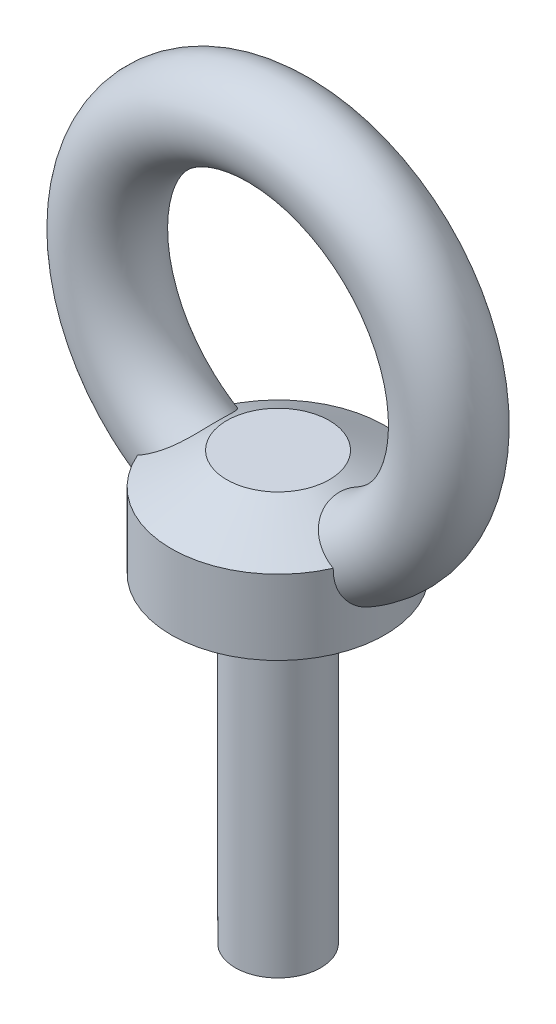
ISO-10303-21;
HEADER;
FILE_DESCRIPTION(('STEP AP214'),'2;1');
FILE_NAME('part.step','',(''),(''),'','','');
FILE_SCHEMA(('AUTOMOTIVE_DESIGN { 1 0 10303 214 1 1 1 1 }'));
ENDSEC;
DATA;
#1=APPLICATION_CONTEXT('core data for automotive mechanical design processes');
#2=APPLICATION_PROTOCOL_DEFINITION('international standard','automotive_design',2000,#1);
#3=PRODUCT_CONTEXT('',#1,'mechanical');
#4=PRODUCT('Part','Part','',(#3));
#5=PRODUCT_RELATED_PRODUCT_CATEGORY('part','',(#4));
#6=PRODUCT_DEFINITION_FORMATION('','',#4);
#7=PRODUCT_DEFINITION_CONTEXT('part definition',#1,'design');
#8=PRODUCT_DEFINITION('design','',#6,#7);
#9=PRODUCT_DEFINITION_SHAPE('','',#8);
#10=(LENGTH_UNIT() NAMED_UNIT(*) SI_UNIT(.MILLI.,.METRE.));
#11=(NAMED_UNIT(*) PLANE_ANGLE_UNIT() SI_UNIT($,.RADIAN.));
#12=(NAMED_UNIT(*) SI_UNIT($,.STERADIAN.) SOLID_ANGLE_UNIT());
#13=UNCERTAINTY_MEASURE_WITH_UNIT(LENGTH_MEASURE(1.E-05),#10,'distance_accuracy_value','');
#14=(GEOMETRIC_REPRESENTATION_CONTEXT(3) GLOBAL_UNCERTAINTY_ASSIGNED_CONTEXT((#13)) GLOBAL_UNIT_ASSIGNED_CONTEXT((#10,
#11,#12)) REPRESENTATION_CONTEXT('',''));
#15=CARTESIAN_POINT('',(0.,0.,0.));
#16=DIRECTION('',(0.,0.,1.));
#17=DIRECTION('',(1.,0.,0.));
#18=AXIS2_PLACEMENT_3D('',#15,#16,#17);
#19=CARTESIAN_POINT('',(0.,0.,0.));
#20=DIRECTION('',(0.,0.,1.));
#21=DIRECTION('',(1.,0.,0.));
#22=AXIS2_PLACEMENT_3D('',#19,#20,#21);
#23=TOROIDAL_SURFACE('',#22,8.,2.);
#24=CARTESIAN_POINT('',(4.71867632498769,-4.9998,1.65350952219836));
#25=CARTESIAN_POINT('',(4.71043652354159,-5.05510436436342,1.67702298459322));
#26=CARTESIAN_POINT('',(4.70234907392348,-5.11084955138957,1.6995399010784));
#27=CARTESIAN_POINT('',(4.68659838049774,-5.22320641222244,1.74250392540779));
#28=CARTESIAN_POINT('',(4.67893524167848,-5.27981829609425,1.76295052201506));
#29=CARTESIAN_POINT('',(4.65669717091965,-5.45143397462198,1.82123777102059));
#30=CARTESIAN_POINT('',(4.6429545472561,-5.5676896069777,1.85579986518022));
#31=CARTESIAN_POINT('',(4.6186334733175,-5.8051945265734,1.91553779168993));
#32=CARTESIAN_POINT('',(4.60811660496548,-5.92649607099462,1.94053296712822));
#33=CARTESIAN_POINT('',(4.592011058236,-6.17115079001464,1.97835091842129));
#34=CARTESIAN_POINT('',(4.58641130966747,-6.29449871572091,1.99120104213013));
#35=CARTESIAN_POINT('',(4.58272202134717,-6.48118330334183,1.99966548089168));
#36=CARTESIAN_POINT('',(4.58229485904432,-6.54424552364722,2.00064489378026));
#37=CARTESIAN_POINT('',(4.58322323943829,-6.67027724186541,1.99851476656425));
#38=CARTESIAN_POINT('',(4.58457879548098,-6.73324673908054,1.99540519584855));
#39=CARTESIAN_POINT('',(4.59151747501785,-6.92092445862263,1.979434220197));
#40=CARTESIAN_POINT('',(4.5999550702752,-7.04512868624405,1.95997140530308));
#41=CARTESIAN_POINT('',(4.61847438140188,-7.22782788523448,1.91570463902985));
#42=CARTESIAN_POINT('',(4.62568772363478,-7.28848947751052,1.8982816997014));
#43=CARTESIAN_POINT('',(4.64194178548102,-7.40778838944614,1.85818516116948));
#44=CARTESIAN_POINT('',(4.6509815165716,-7.46642678413504,1.83551440135648));
#45=CARTESIAN_POINT('',(4.67066502384502,-7.58113495824373,1.78483168287688));
#46=CARTESIAN_POINT('',(4.68131016590024,-7.63720249691417,1.75681517064662));
#47=CARTESIAN_POINT('',(4.70384826802569,-7.74611076871658,1.69554650972436));
#48=CARTESIAN_POINT('',(4.71574110610148,-7.79895181652341,1.66229487274182));
#49=CARTESIAN_POINT('',(4.74980023936574,-7.93993623787331,1.56328406084069));
#50=CARTESIAN_POINT('',(4.77286511579568,-8.02415838242241,1.4921177629713));
#51=CARTESIAN_POINT('',(4.81892608013454,-8.17842083645566,1.33587475143805));
#52=CARTESIAN_POINT('',(4.84192217715849,-8.24846311537116,1.250799972484));
#53=CARTESIAN_POINT('',(4.88435182644448,-8.37039601548237,1.07290575246103));
#54=CARTESIAN_POINT('',(4.90389080578216,-8.42289859157672,0.98052985203245));
#55=CARTESIAN_POINT('',(4.9385050497854,-8.51261424115746,0.787871636209582));
#56=CARTESIAN_POINT('',(4.95358040527698,-8.54982762575496,0.687589481744682));
#57=CARTESIAN_POINT('',(4.97808560124852,-8.60915854115307,0.479464792021207));
#58=CARTESIAN_POINT('',(4.98737777204076,-8.63090958451674,0.371501488009993));
#59=CARTESIAN_POINT('',(4.99885020933851,-8.6576479275543,0.153141918903392));
#60=CARTESIAN_POINT('',(5.00102965149749,-8.66263328413127,0.0427453732943152));
#61=CARTESIAN_POINT('',(4.99804439391676,-8.6557357438241,-0.178834033269949));
#62=CARTESIAN_POINT('',(4.99278581427528,-8.64363722397977,-0.290009004145051));
#63=CARTESIAN_POINT('',(4.97527672945409,-8.60232303682718,-0.50857043749198));
#64=CARTESIAN_POINT('',(4.96302594703904,-8.57310669080939,-0.615956749567201));
#65=CARTESIAN_POINT('',(4.93278984876536,-8.49795646560807,-0.823775772488515));
#66=CARTESIAN_POINT('',(4.91480853627841,-8.4520342540509,-0.92421327835817));
#67=CARTESIAN_POINT('',(4.87501295669387,-8.34417293574151,-1.11524624222071));
#68=CARTESIAN_POINT('',(4.85319928074648,-8.28223629855438,-1.20584321465397));
#69=CARTESIAN_POINT('',(4.8085116192097,-8.14462733129552,-1.37317671976319));
#70=CARTESIAN_POINT('',(4.78565940837755,-8.06918367883914,-1.45010695407073));
#71=CARTESIAN_POINT('',(4.74113766006088,-7.90577025506695,-1.58965251165716));
#72=CARTESIAN_POINT('',(4.71946788565222,-7.81780300594045,-1.65227071070797));
#73=CARTESIAN_POINT('',(4.68008173751315,-7.63383403108379,-1.76071440817016));
#74=CARTESIAN_POINT('',(4.66229295213791,-7.53803578344835,-1.80686004093106));
#75=CARTESIAN_POINT('',(4.63171489609548,-7.33988361181001,-1.88386050118511));
#76=CARTESIAN_POINT('',(4.61892212883392,-7.2375343313207,-1.91472602692578));
#77=CARTESIAN_POINT('',(4.59625635036436,-6.9996339482556,-1.96864365927981));
#78=CARTESIAN_POINT('',(4.58822369339511,-6.86285831166818,-1.98703870013031));
#79=CARTESIAN_POINT('',(4.58115060313392,-6.5872056346552,-2.00327137047614));
#80=CARTESIAN_POINT('',(4.58217041360991,-6.4483206656681,-2.00097127336926));
#81=CARTESIAN_POINT('',(4.59079346705955,-6.19582251465738,-1.98108201407024));
#82=CARTESIAN_POINT('',(4.5972474623754,-6.0819287791801,-1.96615983769639));
#83=CARTESIAN_POINT('',(4.61410118368347,-5.85606901753479,-1.92627591893174));
#84=CARTESIAN_POINT('',(4.62450703738473,-5.74410626883116,-1.90129858148723));
#85=CARTESIAN_POINT('',(4.64794215988166,-5.52492935896759,-1.84325564666077));
#86=CARTESIAN_POINT('',(4.66091729945459,-5.41766531029418,-1.81035432297426));
#87=CARTESIAN_POINT('',(4.68172922741504,-5.25909556782583,-1.75550342425295));
#88=CARTESIAN_POINT('',(4.68887805031459,-5.20671421318398,-1.73634070439604));
#89=CARTESIAN_POINT('',(4.70353299824339,-5.10269531003801,-1.69624064176438));
#90=CARTESIAN_POINT('',(4.71103906577862,-5.05105764357745,-1.67530358412632));
#91=CARTESIAN_POINT('',(4.71867632498769,-4.9998,-1.65350952219836));
#92=B_SPLINE_CURVE_WITH_KNOTS('',3,(#24,#25,#26,#27,#28,#29,#30,#31,#32,#33,#34,#35,#36,#37,#38,
#39,#40,#41,#42,#43,#44,#45,#46,#47,#48,#49,#50,#51,#52,#53,#54,#55,#56,#57,#58,#59,#60,#61,#62,
#63,#64,#65,#66,#67,#68,#69,#70,#71,#72,#73,#74,#75,#76,#77,#78,#79,#80,#81,#82,#83,#84,#85,#86,
#87,#88,#89,#90,#91),.UNSPECIFIED.,.F.,.F.,(4,2,2,2,2,2,2,2,2,2,2,2,2,2,2,2,2,2,2,2,2,2,2,2,2,2,
2,2,2,2,2,2,2,4),(0.,0.181951005817071,0.363946832909348,0.729674535103294,1.1020027442573,
1.47349054458424,1.66255880644497,1.85162848372462,2.22760317192401,2.41795559720547,
2.60820526997683,2.79861772862333,2.98901158686619,3.32507181969517,3.66108534528952,
3.98371300742281,4.30633410426324,4.63636774883411,4.96643964207747,5.30071494700832,
5.63500350661228,5.96905904091547,6.30306309161302,6.63187100886346,6.96061279928643,
7.28256452385491,7.60429051651505,8.01673216006645,8.43192063164556,8.77649161994078,
9.12159909231663,9.4600892193971,9.62875901512361,9.79740175676681),.UNSPECIFIED.);
#93=CARTESIAN_POINT('',(4.58281543001956,-6.5,1.9994506081359));
#94=VERTEX_POINT('',#93);
#95=CARTESIAN_POINT('',(4.58281543001951,-6.50000000000057,-1.99945060813591));
#96=VERTEX_POINT('',#95);
#97=EDGE_CURVE('E73',#94,#96,#92,.T.);
#98=ORIENTED_EDGE('',*,*,#97,.T.);
#99=CARTESIAN_POINT('',(4.58281543001952,-6.5,-1.9994506081359));
#100=CARTESIAN_POINT('',(4.46756641692217,-6.43842926166584,-1.9967094930944));
#101=CARTESIAN_POINT('',(4.35324632878107,-6.37522455223241,-1.98373235769687));
#102=CARTESIAN_POINT('',(4.12931774663029,-6.24650254058209,-1.93693380101886));
#103=CARTESIAN_POINT('',(4.01974498395,-6.18097281070957,-1.90297652040169));
#104=CARTESIAN_POINT('',(3.80943618532682,-6.04919030182962,-1.81373392237749));
#105=CARTESIAN_POINT('',(3.70872915470249,-5.98293589275849,-1.75838157601319));
#106=CARTESIAN_POINT('',(3.52098467252652,-5.85250908747944,-1.62664922144587));
#107=CARTESIAN_POINT('',(3.4339067479597,-5.7883309937795,-1.55033340051687));
#108=CARTESIAN_POINT('',(3.2851875145349,-5.67189916793728,-1.38689054823532));
#109=CARTESIAN_POINT('',(3.2218456481928,-5.61909887948077,-1.301702393643));
#110=CARTESIAN_POINT('',(3.11091493088949,-5.521344682286,-1.11760934305689));
#111=CARTESIAN_POINT('',(3.06332566743107,-5.47639056810262,-1.01870480633616));
#112=CARTESIAN_POINT('',(2.98799216877573,-5.40163513079631,-0.820483220790988));
#113=CARTESIAN_POINT('',(2.95878944431446,-5.3707983491241,-0.722102793641394));
#114=CARTESIAN_POINT('',(2.91278818479547,-5.32063916605737,-0.519673376792681));
#115=CARTESIAN_POINT('',(2.89599026509923,-5.30131733589081,-0.415624106155808));
#116=CARTESIAN_POINT('',(2.87379780464711,-5.2754946111521,-0.203545387477973));
#117=CARTESIAN_POINT('',(2.86853557885885,-5.26914253639505,-0.0954840694748512));
#118=CARTESIAN_POINT('',(2.86942340136048,-5.27019850975048,0.120536827777427));
#119=CARTESIAN_POINT('',(2.87557499854612,-5.27760842541337,0.228496391228981));
#120=CARTESIAN_POINT('',(2.89996592338222,-5.3058874309928,0.443403700423619));
#121=CARTESIAN_POINT('',(2.9184356598447,-5.3270128636786,0.550291963105549));
#122=CARTESIAN_POINT('',(2.96867572810106,-5.38128831617141,0.757681309140842));
#123=CARTESIAN_POINT('',(3.00044122806613,-5.41443396711303,0.858184697561856));
#124=CARTESIAN_POINT('',(3.07724023968651,-5.48954748980041,1.04797834835234));
#125=CARTESIAN_POINT('',(3.12201527796301,-5.53133931488511,1.13744276589343));
#126=CARTESIAN_POINT('',(3.22470072388515,-5.62137128312518,1.30482019771271));
#127=CARTESIAN_POINT('',(3.28261049279829,-5.66961111267188,1.38273377339548));
#128=CARTESIAN_POINT('',(3.40921849673834,-5.76923351944084,1.52433264943859));
#129=CARTESIAN_POINT('',(3.47775399269596,-5.82056251635439,1.58820221446345));
#130=CARTESIAN_POINT('',(3.62416503747491,-5.92495997021428,1.70231625212359));
#131=CARTESIAN_POINT('',(3.70204331626974,-5.97802893227281,1.75255672826704));
#132=CARTESIAN_POINT('',(3.87143154988881,-6.08867624563789,1.84262260489787));
#133=CARTESIAN_POINT('',(3.96353301740991,-6.14627766967112,1.88130240605877));
#134=CARTESIAN_POINT('',(4.15351276190122,-6.26058867260897,1.94260106748517));
#135=CARTESIAN_POINT('',(4.25139654740549,-6.31729733371674,1.96520433620427));
#136=CARTESIAN_POINT('',(4.4632190064873,-6.43605100865769,1.99632817463592));
#137=CARTESIAN_POINT('',(4.57761305609282,-6.49785412866087,2.00268486722153));
#138=CARTESIAN_POINT('',(4.80723807556188,-6.61815656366623,1.99527377189443));
#139=CARTESIAN_POINT('',(4.92246729652165,-6.67666130526698,1.9815401040719));
#140=CARTESIAN_POINT('',(5.03660131737279,-6.73310548447476,1.95784756731662));
#141=B_SPLINE_CURVE_WITH_KNOTS('',3,(#99,#100,#101,#102,#103,#104,#105,#106,#107,#108,#109,#110,
#111,#112,#113,#114,#115,#116,#117,#118,#119,#120,#121,#122,#123,#124,#125,#126,#127,#128,#129,
#130,#131,#132,#133,#134,#135,#136,#137,#138,#139,#140),.UNSPECIFIED.,.F.,.F.,(4,2,2,2,2,2,2,2,
2,2,2,2,2,2,2,2,2,2,2,2,4),(0.,0.391935200561145,0.786435415822805,1.18218171821807,
1.57672955260502,1.93040607400826,2.28407333331526,2.60405356012834,2.92404965903969,
3.24769733491584,3.57138893412704,3.90131158438089,4.23111444101944,4.55476701736213,
4.87840385808569,5.1975006506755,5.51669091192091,5.86125798600141,6.20615877849902,
6.59504986397719,6.98328124981199),.UNSPECIFIED.);
#142=EDGE_CURVE('E71',#96,#94,#141,.T.);
#143=ORIENTED_EDGE('',*,*,#142,.T.);
#144=EDGE_LOOP('',(#98,#143));
#145=FACE_BOUND('',#144,.T.);
#146=CARTESIAN_POINT('',(-4.71867632498769,-4.9998,-1.65350952219836));
#147=CARTESIAN_POINT('',(-4.71043652354159,-5.05510436436342,-1.67702298459322));
#148=CARTESIAN_POINT('',(-4.70234907392348,-5.11084955138957,-1.6995399010784));
#149=CARTESIAN_POINT('',(-4.68659838049774,-5.22320641222244,-1.74250392540779));
#150=CARTESIAN_POINT('',(-4.67893524167848,-5.27981829609425,-1.76295052201506));
#151=CARTESIAN_POINT('',(-4.65669717091965,-5.45143397462198,-1.82123777102059));
#152=CARTESIAN_POINT('',(-4.6429545472561,-5.5676896069777,-1.85579986518022));
#153=CARTESIAN_POINT('',(-4.6186334733175,-5.8051945265734,-1.91553779168993));
#154=CARTESIAN_POINT('',(-4.60811660496548,-5.92649607099462,-1.94053296712822));
#155=CARTESIAN_POINT('',(-4.592011058236,-6.17115079001464,-1.97835091842129));
#156=CARTESIAN_POINT('',(-4.58641130966747,-6.29449871572091,-1.99120104213013));
#157=CARTESIAN_POINT('',(-4.58272202134717,-6.48118330334183,-1.99966548089168));
#158=CARTESIAN_POINT('',(-4.58229485904432,-6.54424552364722,-2.00064489378026));
#159=CARTESIAN_POINT('',(-4.58322323943829,-6.67027724186541,-1.99851476656425));
#160=CARTESIAN_POINT('',(-4.58457879548098,-6.73324673908054,-1.99540519584855));
#161=CARTESIAN_POINT('',(-4.59151747501785,-6.92092445862263,-1.979434220197));
#162=CARTESIAN_POINT('',(-4.5999550702752,-7.04512868624405,-1.95997140530308));
#163=CARTESIAN_POINT('',(-4.61847438140188,-7.22782788523448,-1.91570463902985));
#164=CARTESIAN_POINT('',(-4.62568772363478,-7.28848947751052,-1.8982816997014));
#165=CARTESIAN_POINT('',(-4.64194178548102,-7.40778838944614,-1.85818516116948));
#166=CARTESIAN_POINT('',(-4.6509815165716,-7.46642678413504,-1.83551440135648));
#167=CARTESIAN_POINT('',(-4.67066502384502,-7.58113495824373,-1.78483168287688));
#168=CARTESIAN_POINT('',(-4.68131016590024,-7.63720249691417,-1.75681517064662));
#169=CARTESIAN_POINT('',(-4.70384826802569,-7.74611076871658,-1.69554650972436));
#170=CARTESIAN_POINT('',(-4.71574110610148,-7.79895181652341,-1.66229487274182));
#171=CARTESIAN_POINT('',(-4.74980023936574,-7.93993623787331,-1.56328406084069));
#172=CARTESIAN_POINT('',(-4.77286511579568,-8.02415838242241,-1.4921177629713));
#173=CARTESIAN_POINT('',(-4.81892608013454,-8.17842083645566,-1.33587475143805));
#174=CARTESIAN_POINT('',(-4.84192217715849,-8.24846311537116,-1.250799972484));
#175=CARTESIAN_POINT('',(-4.88435182644448,-8.37039601548237,-1.07290575246103));
#176=CARTESIAN_POINT('',(-4.90389080578216,-8.42289859157672,-0.98052985203245));
#177=CARTESIAN_POINT('',(-4.9385050497854,-8.51261424115746,-0.787871636209582));
#178=CARTESIAN_POINT('',(-4.95358040527698,-8.54982762575496,-0.687589481744682));
#179=CARTESIAN_POINT('',(-4.97808560124852,-8.60915854115307,-0.479464792021207));
#180=CARTESIAN_POINT('',(-4.98737777204076,-8.63090958451674,-0.371501488009993));
#181=CARTESIAN_POINT('',(-4.99885020933851,-8.6576479275543,-0.153141918903392));
#182=CARTESIAN_POINT('',(-5.00102965149749,-8.66263328413127,-0.0427453732943152));
#183=CARTESIAN_POINT('',(-4.99804439391676,-8.6557357438241,0.178834033269949));
#184=CARTESIAN_POINT('',(-4.99278581427528,-8.64363722397977,0.290009004145051));
#185=CARTESIAN_POINT('',(-4.97527672945409,-8.60232303682718,0.50857043749198));
#186=CARTESIAN_POINT('',(-4.96302594703904,-8.57310669080939,0.615956749567201));
#187=CARTESIAN_POINT('',(-4.93278984876536,-8.49795646560807,0.823775772488515));
#188=CARTESIAN_POINT('',(-4.91480853627841,-8.4520342540509,0.92421327835817));
#189=CARTESIAN_POINT('',(-4.87501295669387,-8.34417293574151,1.11524624222071));
#190=CARTESIAN_POINT('',(-4.85319928074648,-8.28223629855438,1.20584321465397));
#191=CARTESIAN_POINT('',(-4.8085116192097,-8.14462733129552,1.37317671976319));
#192=CARTESIAN_POINT('',(-4.78565940837755,-8.06918367883914,1.45010695407073));
#193=CARTESIAN_POINT('',(-4.74113766006088,-7.90577025506695,1.58965251165716));
#194=CARTESIAN_POINT('',(-4.71946788565222,-7.81780300594045,1.65227071070797));
#195=CARTESIAN_POINT('',(-4.68008173751315,-7.63383403108379,1.76071440817016));
#196=CARTESIAN_POINT('',(-4.66229295213791,-7.53803578344835,1.80686004093106));
#197=CARTESIAN_POINT('',(-4.63171489609548,-7.33988361181001,1.88386050118511));
#198=CARTESIAN_POINT('',(-4.61892212883392,-7.2375343313207,1.91472602692578));
#199=CARTESIAN_POINT('',(-4.59625635036436,-6.9996339482556,1.96864365927981));
#200=CARTESIAN_POINT('',(-4.58822369339511,-6.86285831166818,1.98703870013031));
#201=CARTESIAN_POINT('',(-4.58115060313392,-6.5872056346552,2.00327137047614));
#202=CARTESIAN_POINT('',(-4.58217041360991,-6.4483206656681,2.00097127336926));
#203=CARTESIAN_POINT('',(-4.59079346705955,-6.19582251465738,1.98108201407024));
#204=CARTESIAN_POINT('',(-4.5972474623754,-6.0819287791801,1.96615983769639));
#205=CARTESIAN_POINT('',(-4.61410118368347,-5.85606901753479,1.92627591893174));
#206=CARTESIAN_POINT('',(-4.62450703738473,-5.74410626883116,1.90129858148723));
#207=CARTESIAN_POINT('',(-4.64794215988166,-5.52492935896759,1.84325564666077));
#208=CARTESIAN_POINT('',(-4.66091729945459,-5.41766531029418,1.81035432297426));
#209=CARTESIAN_POINT('',(-4.68172922741504,-5.25909556782583,1.75550342425295));
#210=CARTESIAN_POINT('',(-4.68887805031459,-5.20671421318398,1.73634070439604));
#211=CARTESIAN_POINT('',(-4.70353299824339,-5.10269531003801,1.69624064176438));
#212=CARTESIAN_POINT('',(-4.71103906577862,-5.05105764357745,1.67530358412632));
#213=CARTESIAN_POINT('',(-4.71867632498769,-4.9998,1.65350952219836));
#214=B_SPLINE_CURVE_WITH_KNOTS('',3,(#146,#147,#148,#149,#150,#151,#152,#153,#154,#155,#156,
#157,#158,#159,#160,#161,#162,#163,#164,#165,#166,#167,#168,#169,#170,#171,#172,#173,#174,#175,
#176,#177,#178,#179,#180,#181,#182,#183,#184,#185,#186,#187,#188,#189,#190,#191,#192,#193,#194,
#195,#196,#197,#198,#199,#200,#201,#202,#203,#204,#205,#206,#207,#208,#209,#210,#211,#212,#213),
.UNSPECIFIED.,.F.,.F.,(4,2,2,2,2,2,2,2,2,2,2,2,2,2,2,2,2,2,2,2,2,2,2,2,2,2,2,2,2,2,2,2,2,4),(0.,
0.181951005817071,0.363946832909348,0.729674535103294,1.1020027442573,1.47349054458424,
1.66255880644497,1.85162848372462,2.22760317192401,2.41795559720547,2.60820526997683,
2.79861772862333,2.98901158686619,3.32507181969517,3.66108534528952,3.98371300742281,
4.30633410426324,4.63636774883411,4.96643964207747,5.30071494700832,5.63500350661228,
5.96905904091547,6.30306309161302,6.63187100886346,6.96061279928643,7.28256452385491,
7.60429051651505,8.01673216006645,8.43192063164556,8.77649161994078,9.12159909231663,
9.4600892193971,9.62875901512361,9.79740175676681),.UNSPECIFIED.);
#215=CARTESIAN_POINT('',(-4.58281543001956,-6.5,-1.9994506081359));
#216=VERTEX_POINT('',#215);
#217=CARTESIAN_POINT('',(-4.58281543001951,-6.50000000000057,1.99945060813591));
#218=VERTEX_POINT('',#217);
#219=EDGE_CURVE('E81',#216,#218,#214,.T.);
#220=ORIENTED_EDGE('',*,*,#219,.T.);
#221=CARTESIAN_POINT('',(-4.58281543001975,-6.50000000000013,1.9994506081359));
#222=CARTESIAN_POINT('',(-4.4675664169224,-6.43842926166597,1.99670949309442));
#223=CARTESIAN_POINT('',(-4.3532463287813,-6.37522455223253,1.9837323576969));
#224=CARTESIAN_POINT('',(-4.1293177466305,-6.24650254058221,1.93693380101892));
#225=CARTESIAN_POINT('',(-4.0197449839502,-6.18097281070969,1.90297652040176));
#226=CARTESIAN_POINT('',(-3.809436185327,-6.04919030182974,1.81373392237758));
#227=CARTESIAN_POINT('',(-3.70872915470266,-5.98293589275861,1.75838157601329));
#228=CARTESIAN_POINT('',(-3.52098467252667,-5.85250908747955,1.62664922144599));
#229=CARTESIAN_POINT('',(-3.43390674795984,-5.7883309937796,1.550333400517));
#230=CARTESIAN_POINT('',(-3.28518751453502,-5.67189916793737,1.38689054823547));
#231=CARTESIAN_POINT('',(-3.22184564819291,-5.61909887948086,1.30170239364315));
#232=CARTESIAN_POINT('',(-3.11091493088958,-5.52134468228607,1.11760934305705));
#233=CARTESIAN_POINT('',(-3.06332566743114,-5.47639056810269,1.01870480633633));
#234=CARTESIAN_POINT('',(-2.98799216877578,-5.40163513079636,0.820483220791154));
#235=CARTESIAN_POINT('',(-2.9587894443145,-5.37079834912415,0.722102793641563));
#236=CARTESIAN_POINT('',(-2.9127881847955,-5.32063916605741,0.519673376792855));
#237=CARTESIAN_POINT('',(-2.89599026509925,-5.30131733589084,0.415624106155983));
#238=CARTESIAN_POINT('',(-2.87379780464713,-5.27549461115211,0.203545387478152));
#239=CARTESIAN_POINT('',(-2.86853557885885,-5.26914253639506,0.0954840694750316));
#240=CARTESIAN_POINT('',(-2.86942340136047,-5.27019850975047,-0.120536827777245));
#241=CARTESIAN_POINT('',(-2.8755749985461,-5.27760842541335,-0.228496391228799));
#242=CARTESIAN_POINT('',(-2.89996592338219,-5.30588743099277,-0.443403700423439));
#243=CARTESIAN_POINT('',(-2.91843565984466,-5.32701286367856,-0.550291963105372));
#244=CARTESIAN_POINT('',(-2.96867572810101,-5.38128831617136,-0.757681309140672));
#245=CARTESIAN_POINT('',(-3.00044122806607,-5.41443396711297,-0.85818469756169));
#246=CARTESIAN_POINT('',(-3.07724023968644,-5.48954748980035,-1.04797834835219));
#247=CARTESIAN_POINT('',(-3.12201527796293,-5.53133931488504,-1.13744276589329));
#248=CARTESIAN_POINT('',(-3.22470072388506,-5.6213712831251,-1.30482019771258));
#249=CARTESIAN_POINT('',(-3.28261049279819,-5.6696111126718,-1.38273377339535));
#250=CARTESIAN_POINT('',(-3.40921849673823,-5.76923351944076,-1.52433264943848));
#251=CARTESIAN_POINT('',(-3.47775399269584,-5.8205625163543,-1.58820221446335));
#252=CARTESIAN_POINT('',(-3.62416503747478,-5.92495997021419,-1.7023162521235));
#253=CARTESIAN_POINT('',(-3.7020433162696,-5.97802893227272,-1.75255672826696));
#254=CARTESIAN_POINT('',(-3.87143154988867,-6.08867624563779,-1.8426226048978));
#255=CARTESIAN_POINT('',(-3.96353301740976,-6.14627766967102,-1.88130240605871));
#256=CARTESIAN_POINT('',(-4.15351276190105,-6.26058867260887,-1.94260106748513));
#257=CARTESIAN_POINT('',(-4.25139654740532,-6.31729733371664,-1.96520433620423));
#258=CARTESIAN_POINT('',(-4.46321900648712,-6.43605100865759,-1.9963281746359));
#259=CARTESIAN_POINT('',(-4.57761305609263,-6.49785412866077,-2.00268486722152));
#260=CARTESIAN_POINT('',(-4.80723807556168,-6.61815656366613,-1.99527377189445));
#261=CARTESIAN_POINT('',(-4.92246729652145,-6.67666130526688,-1.98154010407193));
#262=CARTESIAN_POINT('',(-5.03660131737259,-6.73310548447466,-1.95784756731666));
#263=B_SPLINE_CURVE_WITH_KNOTS('',3,(#221,#222,#223,#224,#225,#226,#227,#228,#229,#230,#231,
#232,#233,#234,#235,#236,#237,#238,#239,#240,#241,#242,#243,#244,#245,#246,#247,#248,#249,#250,
#251,#252,#253,#254,#255,#256,#257,#258,#259,#260,#261,#262),.UNSPECIFIED.,.F.,.F.,(4,2,2,2,2,2,
2,2,2,2,2,2,2,2,2,2,2,2,2,2,4),(0.,0.391935200561159,0.786435415822833,1.18218171821812,
1.57672955260508,1.93040607400833,2.28407333331535,2.60405356012843,2.92404965903978,
3.24769733491592,3.57138893412713,3.90131158438098,4.23111444101953,4.55476701736222,
4.87840385808578,5.19750065067559,5.516690911921,5.86125798600148,6.20615877849909,
6.59504986397724,6.98328124981204),.UNSPECIFIED.);
#264=EDGE_CURVE('E47',#218,#216,#263,.T.);
#265=ORIENTED_EDGE('',*,*,#264,.T.);
#266=EDGE_LOOP('',(#220,#265));
#267=FACE_BOUND('',#266,.T.);
#268=ADVANCED_FACE('F37',(#145,#267),#23,.T.);
#269=CARTESIAN_POINT('',(0.,-5.,0.));
#270=DIRECTION('',(0.,-1.,0.));
#271=DIRECTION('',(0.,0.,-1.));
#272=AXIS2_PLACEMENT_3D('',#269,#270,#271);
#273=CYLINDRICAL_SURFACE('',#272,5.);
#274=ORIENTED_EDGE('',*,*,#219,.F.);
#275=CARTESIAN_POINT('',(0.,-6.5,0.));
#276=DIRECTION('',(0.,1.,0.));
#277=DIRECTION('',(0.,0.,1.));
#278=AXIS2_PLACEMENT_3D('',#275,#276,#277);
#279=CIRCLE('',#278,5.);
#280=EDGE_CURVE('E77',#216,#96,#279,.F.);
#281=ORIENTED_EDGE('',*,*,#280,.T.);
#282=ORIENTED_EDGE('',*,*,#97,.F.);
#283=CARTESIAN_POINT('',(0.,-6.5,0.));
#284=DIRECTION('',(0.,1.,0.));
#285=DIRECTION('',(0.,0.,1.));
#286=AXIS2_PLACEMENT_3D('',#283,#284,#285);
#287=CIRCLE('',#286,5.);
#288=EDGE_CURVE('E59',#94,#218,#287,.F.);
#289=ORIENTED_EDGE('',*,*,#288,.T.);
#290=EDGE_LOOP('',(#274,#281,#282,#289));
#291=FACE_BOUND('',#290,.T.);
#292=CARTESIAN_POINT('',(0.,-10.,0.));
#293=DIRECTION('',(0.,1.,0.));
#294=DIRECTION('',(0.,0.,1.));
#295=AXIS2_PLACEMENT_3D('',#292,#293,#294);
#296=CIRCLE('',#295,5.);
#297=CARTESIAN_POINT('',(0.,-10.,5.));
#298=VERTEX_POINT('',#297);
#299=EDGE_CURVE('E82',#298,#298,#296,.T.);
#300=ORIENTED_EDGE('',*,*,#299,.T.);
#301=EDGE_LOOP('',(#300));
#302=FACE_BOUND('',#301,.T.);
#303=ADVANCED_FACE('F79',(#291,#302),#273,.T.);
#304=CARTESIAN_POINT('',(0.,-5.,0.));
#305=DIRECTION('',(0.,1.,0.));
#306=DIRECTION('',(0.,0.,1.));
#307=AXIS2_PLACEMENT_3D('',#304,#305,#306);
#308=PLANE('',#307);
#309=CARTESIAN_POINT('',(0.,-5.,0.));
#310=DIRECTION('',(0.,1.,0.));
#311=DIRECTION('',(0.,0.,1.));
#312=AXIS2_PLACEMENT_3D('',#309,#310,#311);
#313=CIRCLE('',#312,2.40192378864669);
#314=CARTESIAN_POINT('',(-2.2015146800682,-5.,0.960505595981146));
#315=VERTEX_POINT('',#314);
#316=EDGE_CURVE('E52',#315,#315,#313,.T.);
#317=ORIENTED_EDGE('',*,*,#316,.T.);
#318=EDGE_LOOP('',(#317));
#319=FACE_BOUND('',#318,.T.);
#320=ADVANCED_FACE('F131',(#319),#308,.T.);
#321=CARTESIAN_POINT('',(0.,-10.,0.));
#322=DIRECTION('',(0.,1.,0.));
#323=DIRECTION('',(0.,0.,1.));
#324=AXIS2_PLACEMENT_3D('',#321,#322,#323);
#325=PLANE('',#324);
#326=CARTESIAN_POINT('',(0.,-10.,0.));
#327=DIRECTION('',(0.,1.,0.));
#328=DIRECTION('',(0.,0.,1.));
#329=AXIS2_PLACEMENT_3D('',#326,#327,#328);
#330=CIRCLE('',#329,2.);
#331=CARTESIAN_POINT('',(0.,-10.,2.));
#332=VERTEX_POINT('',#331);
#333=EDGE_CURVE('E11',#332,#332,#330,.F.);
#334=ORIENTED_EDGE('',*,*,#333,.F.);
#335=EDGE_LOOP('',(#334));
#336=FACE_BOUND('',#335,.T.);
#337=ORIENTED_EDGE('',*,*,#299,.F.);
#338=EDGE_LOOP('',(#337));
#339=FACE_BOUND('',#338,.T.);
#340=ADVANCED_FACE('F128',(#336,#339),#325,.F.);
#341=CARTESIAN_POINT('',(0.,-5.,0.));
#342=DIRECTION('',(0.,-1.,0.));
#343=DIRECTION('',(0.,0.,-1.));
#344=AXIS2_PLACEMENT_3D('',#341,#342,#343);
#345=CONICAL_SURFACE('',#344,2.40192378864669,1.0471975511966);
#346=ORIENTED_EDGE('',*,*,#142,.F.);
#347=ORIENTED_EDGE('',*,*,#280,.F.);
#348=ORIENTED_EDGE('',*,*,#264,.F.);
#349=ORIENTED_EDGE('',*,*,#288,.F.);
#350=EDGE_LOOP('',(#346,#347,#348,#349));
#351=FACE_BOUND('',#350,.T.);
#352=ORIENTED_EDGE('',*,*,#316,.F.);
#353=EDGE_LOOP('',(#352));
#354=FACE_BOUND('',#353,.T.);
#355=ADVANCED_FACE('F40',(#351,#354),#345,.T.);
#356=CARTESIAN_POINT('',(0.,-25.,0.));
#357=DIRECTION('',(0.,1.,0.));
#358=DIRECTION('',(0.,0.,1.));
#359=AXIS2_PLACEMENT_3D('',#356,#357,#358);
#360=CYLINDRICAL_SURFACE('',#359,2.);
#361=CARTESIAN_POINT('',(0.,-25.,0.));
#362=DIRECTION('',(0.,-1.,0.));
#363=DIRECTION('',(0.,0.,-1.));
#364=AXIS2_PLACEMENT_3D('',#361,#362,#363);
#365=CIRCLE('',#364,2.);
#366=CARTESIAN_POINT('',(0.,-25.,-2.));
#367=VERTEX_POINT('',#366);
#368=EDGE_CURVE('E116',#367,#367,#365,.T.);
#369=ORIENTED_EDGE('',*,*,#368,.F.);
#370=EDGE_LOOP('',(#369));
#371=FACE_BOUND('',#370,.T.);
#372=ORIENTED_EDGE('',*,*,#333,.T.);
#373=EDGE_LOOP('',(#372));
#374=FACE_BOUND('',#373,.T.);
#375=ADVANCED_FACE('F122',(#371,#374),#360,.T.);
#376=CARTESIAN_POINT('',(0.,-25.,0.));
#377=DIRECTION('',(0.,-1.,0.));
#378=DIRECTION('',(0.,0.,-1.));
#379=AXIS2_PLACEMENT_3D('',#376,#377,#378);
#380=PLANE('',#379);
#381=ORIENTED_EDGE('',*,*,#368,.T.);
#382=EDGE_LOOP('',(#381));
#383=FACE_BOUND('',#382,.T.);
#384=ADVANCED_FACE('F120',(#383),#380,.T.);
#385=CLOSED_SHELL('',(#268,#303,#320,#340,#355,#375,#384));
#386=MANIFOLD_SOLID_BREP('B2',#385);
#387=ADVANCED_BREP_SHAPE_REPRESENTATION('',(#18,#386),#14);
#388=SHAPE_DEFINITION_REPRESENTATION(#9,#387);
ENDSEC;
END-ISO-10303-21;
